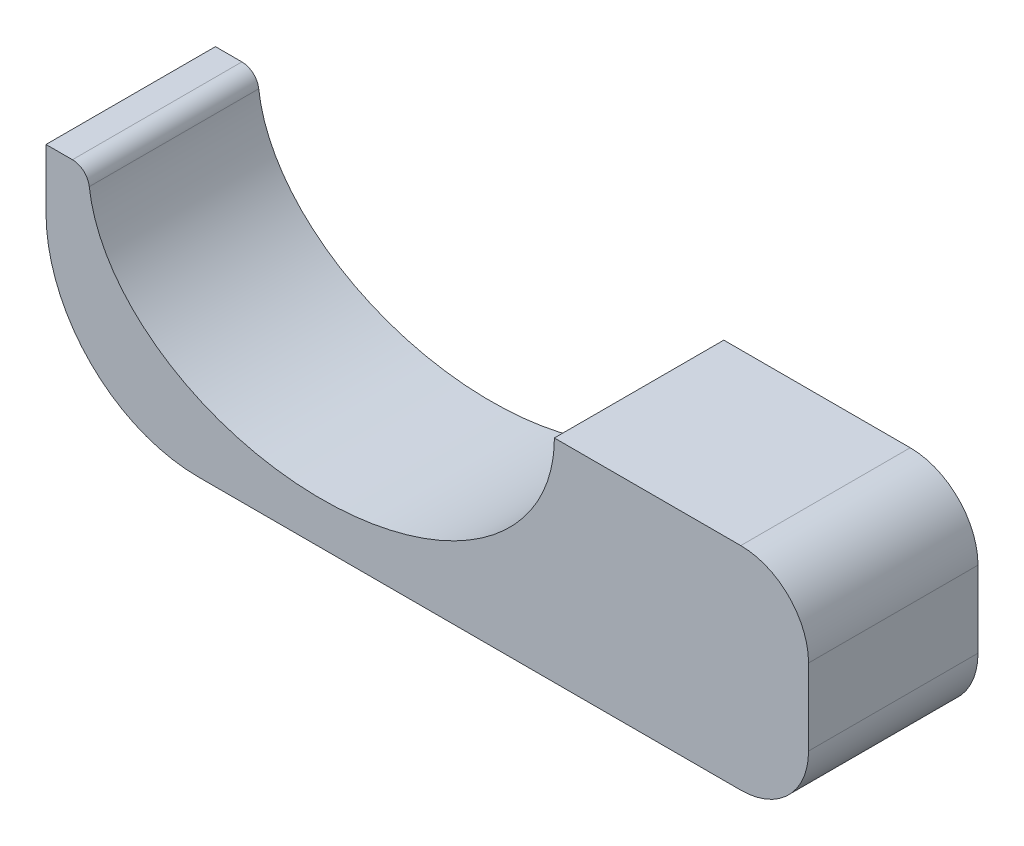
ISO-10303-21;
HEADER;
FILE_DESCRIPTION(('STEP AP214'),'2;1');
FILE_NAME('part.step','',(''),(''),'','','');
FILE_SCHEMA(('AUTOMOTIVE_DESIGN { 1 0 10303 214 1 1 1 1 }'));
ENDSEC;
DATA;
#1=APPLICATION_CONTEXT('core data for automotive mechanical design processes');
#2=APPLICATION_PROTOCOL_DEFINITION('international standard','automotive_design',2000,#1);
#3=PRODUCT_CONTEXT('',#1,'mechanical');
#4=PRODUCT('Part','Part','',(#3));
#5=PRODUCT_RELATED_PRODUCT_CATEGORY('part','',(#4));
#6=PRODUCT_DEFINITION_FORMATION('','',#4);
#7=PRODUCT_DEFINITION_CONTEXT('part definition',#1,'design');
#8=PRODUCT_DEFINITION('design','',#6,#7);
#9=PRODUCT_DEFINITION_SHAPE('','',#8);
#10=(LENGTH_UNIT() NAMED_UNIT(*) SI_UNIT(.MILLI.,.METRE.));
#11=(NAMED_UNIT(*) PLANE_ANGLE_UNIT() SI_UNIT($,.RADIAN.));
#12=(NAMED_UNIT(*) SI_UNIT($,.STERADIAN.) SOLID_ANGLE_UNIT());
#13=UNCERTAINTY_MEASURE_WITH_UNIT(LENGTH_MEASURE(1.E-05),#10,'distance_accuracy_value','');
#14=(GEOMETRIC_REPRESENTATION_CONTEXT(3) GLOBAL_UNCERTAINTY_ASSIGNED_CONTEXT((#13)) GLOBAL_UNIT_ASSIGNED_CONTEXT((#10,
#11,#12)) REPRESENTATION_CONTEXT('',''));
#15=CARTESIAN_POINT('',(0.,0.,0.));
#16=DIRECTION('',(0.,0.,1.));
#17=DIRECTION('',(1.,0.,0.));
#18=AXIS2_PLACEMENT_3D('',#15,#16,#17);
#19=CARTESIAN_POINT('',(0.,31.75,0.));
#20=DIRECTION('',(0.,1.,0.));
#21=DIRECTION('',(0.,0.,1.));
#22=AXIS2_PLACEMENT_3D('',#19,#20,#21);
#23=PLANE('',#22);
#24=DIRECTION('',(1.,0.,0.));
#25=VECTOR('',#24,1.);
#26=CARTESIAN_POINT('',(-57.15,31.75,12.7));
#27=LINE('',#26,#25);
#28=CARTESIAN_POINT('',(-57.15,31.75,12.7));
#29=VERTEX_POINT('',#28);
#30=CARTESIAN_POINT('',(-53.1861536525858,31.75,12.7));
#31=VERTEX_POINT('',#30);
#32=EDGE_CURVE('E188',#29,#31,#27,.T.);
#33=ORIENTED_EDGE('',*,*,#32,.T.);
#34=DIRECTION('',(0.,0.,-1.));
#35=VECTOR('',#34,1.);
#36=CARTESIAN_POINT('',(-53.1861536525858,31.75,-12.7));
#37=LINE('',#36,#35);
#38=CARTESIAN_POINT('',(-53.1861536525858,31.75,-12.7));
#39=VERTEX_POINT('',#38);
#40=EDGE_CURVE('E153',#31,#39,#37,.T.);
#41=ORIENTED_EDGE('',*,*,#40,.T.);
#42=DIRECTION('',(-1.,0.,0.));
#43=VECTOR('',#42,1.);
#44=CARTESIAN_POINT('',(-57.15,31.75,-12.7));
#45=LINE('',#44,#43);
#46=CARTESIAN_POINT('',(-57.15,31.75,-12.7));
#47=VERTEX_POINT('',#46);
#48=EDGE_CURVE('E126',#39,#47,#45,.T.);
#49=ORIENTED_EDGE('',*,*,#48,.T.);
#50=DIRECTION('',(0.,0.,1.));
#51=VECTOR('',#50,1.);
#52=CARTESIAN_POINT('',(-57.15,31.75,-12.7));
#53=LINE('',#52,#51);
#54=EDGE_CURVE('E125',#47,#29,#53,.T.);
#55=ORIENTED_EDGE('',*,*,#54,.T.);
#56=EDGE_LOOP('',(#33,#41,#49,#55));
#57=FACE_BOUND('',#56,.T.);
#58=ADVANCED_FACE('F37',(#57),#23,.T.);
#59=CARTESIAN_POINT('',(57.15,31.75,-12.7));
#60=DIRECTION('',(-1.,0.,0.));
#61=DIRECTION('',(0.,0.,1.));
#62=AXIS2_PLACEMENT_3D('',#59,#60,#61);
#63=PLANE('',#62);
#64=DIRECTION('',(0.,-1.,0.));
#65=VECTOR('',#64,1.);
#66=CARTESIAN_POINT('',(57.15,31.75,12.7));
#67=LINE('',#66,#65);
#68=CARTESIAN_POINT('',(57.15,21.59,12.7));
#69=VERTEX_POINT('',#68);
#70=CARTESIAN_POINT('',(57.15,10.16,12.7));
#71=VERTEX_POINT('',#70);
#72=EDGE_CURVE('E179',#69,#71,#67,.T.);
#73=ORIENTED_EDGE('',*,*,#72,.T.);
#74=DIRECTION('',(0.,0.,-1.));
#75=VECTOR('',#74,1.);
#76=CARTESIAN_POINT('',(57.15,10.16,-12.7));
#77=LINE('',#76,#75);
#78=CARTESIAN_POINT('',(57.15,10.16,-12.7));
#79=VERTEX_POINT('',#78);
#80=EDGE_CURVE('E168',#71,#79,#77,.T.);
#81=ORIENTED_EDGE('',*,*,#80,.T.);
#82=DIRECTION('',(0.,-1.,0.));
#83=VECTOR('',#82,1.);
#84=CARTESIAN_POINT('',(57.15,31.75,-12.7));
#85=LINE('',#84,#83);
#86=CARTESIAN_POINT('',(57.15,21.59,-12.7));
#87=VERTEX_POINT('',#86);
#88=EDGE_CURVE('E144',#87,#79,#85,.T.);
#89=ORIENTED_EDGE('',*,*,#88,.F.);
#90=DIRECTION('',(0.,0.,-1.));
#91=VECTOR('',#90,1.);
#92=CARTESIAN_POINT('',(57.15,21.59,12.7));
#93=LINE('',#92,#91);
#94=EDGE_CURVE('E166',#87,#69,#93,.F.);
#95=ORIENTED_EDGE('',*,*,#94,.T.);
#96=EDGE_LOOP('',(#73,#81,#89,#95));
#97=FACE_BOUND('',#96,.T.);
#98=ADVANCED_FACE('F184',(#97),#63,.F.);
#99=CARTESIAN_POINT('',(-57.15,31.75,-12.7));
#100=DIRECTION('',(0.,0.,1.));
#101=DIRECTION('',(1.,0.,0.));
#102=AXIS2_PLACEMENT_3D('',#99,#100,#101);
#103=PLANE('',#102);
#104=ORIENTED_EDGE('',*,*,#88,.T.);
#105=CARTESIAN_POINT('',(46.99,10.16,-12.7));
#106=DIRECTION('',(0.,0.,1.));
#107=DIRECTION('',(1.,0.,0.));
#108=AXIS2_PLACEMENT_3D('',#105,#106,#107);
#109=CIRCLE('',#108,10.16);
#110=CARTESIAN_POINT('',(46.99,0.,-12.7));
#111=VERTEX_POINT('',#110);
#112=EDGE_CURVE('E173',#79,#111,#109,.F.);
#113=ORIENTED_EDGE('',*,*,#112,.T.);
#114=DIRECTION('',(-1.,0.,0.));
#115=VECTOR('',#114,1.);
#116=CARTESIAN_POINT('',(-57.15,0.,-12.7));
#117=LINE('',#116,#115);
#118=CARTESIAN_POINT('',(-34.29,0.,-12.7));
#119=VERTEX_POINT('',#118);
#120=EDGE_CURVE('E138',#111,#119,#117,.T.);
#121=ORIENTED_EDGE('',*,*,#120,.T.);
#122=CARTESIAN_POINT('',(-34.29,22.86,-12.7));
#123=DIRECTION('',(0.,0.,1.));
#124=DIRECTION('',(1.,0.,0.));
#125=AXIS2_PLACEMENT_3D('',#122,#123,#124);
#126=CIRCLE('',#125,22.86);
#127=CARTESIAN_POINT('',(-57.15,22.86,-12.7));
#128=VERTEX_POINT('',#127);
#129=EDGE_CURVE('E164',#119,#128,#126,.F.);
#130=ORIENTED_EDGE('',*,*,#129,.T.);
#131=DIRECTION('',(0.,-1.,0.));
#132=VECTOR('',#131,1.);
#133=CARTESIAN_POINT('',(-57.15,31.75,-12.7));
#134=LINE('',#133,#132);
#135=EDGE_CURVE('E148',#47,#128,#134,.T.);
#136=ORIENTED_EDGE('',*,*,#135,.F.);
#137=ORIENTED_EDGE('',*,*,#48,.F.);
#138=CARTESIAN_POINT('',(-53.1861536525858,29.21,-12.7));
#139=DIRECTION('',(0.,0.,1.));
#140=DIRECTION('',(1.,0.,0.));
#141=AXIS2_PLACEMENT_3D('',#138,#139,#140);
#142=CIRCLE('',#141,2.54);
#143=CARTESIAN_POINT('',(-50.6646663698128,29.5161076327277,-12.7));
#144=VERTEX_POINT('',#143);
#145=EDGE_CURVE('E134',#39,#144,#142,.F.);
#146=ORIENTED_EDGE('',*,*,#145,.T.);
#147=CARTESIAN_POINT('',(-15.875,31.75,-12.7));
#148=DIRECTION('',(0.,0.,1.));
#149=DIRECTION('',(-1.,0.,0.));
#150=AXIS2_PLACEMENT_3D('',#147,#148,#149);
#151=ELLIPSE('',#150,34.925,25.4);
#152=CARTESIAN_POINT('',(19.05,31.75,-12.7));
#153=VERTEX_POINT('',#152);
#154=EDGE_CURVE('E129',#144,#153,#151,.T.);
#155=ORIENTED_EDGE('',*,*,#154,.T.);
#156=CARTESIAN_POINT('',(46.99,31.75,-12.7));
#157=VERTEX_POINT('',#156);
#158=EDGE_CURVE('E118',#157,#153,#45,.T.);
#159=ORIENTED_EDGE('',*,*,#158,.F.);
#160=CARTESIAN_POINT('',(46.99,21.59,-12.7));
#161=DIRECTION('',(0.,0.,1.));
#162=DIRECTION('',(1.,0.,0.));
#163=AXIS2_PLACEMENT_3D('',#160,#161,#162);
#164=CIRCLE('',#163,10.16);
#165=EDGE_CURVE('E171',#157,#87,#164,.F.);
#166=ORIENTED_EDGE('',*,*,#165,.T.);
#167=EDGE_LOOP('',(#104,#113,#121,#130,#136,#137,#146,#155,#159,#166));
#168=FACE_BOUND('',#167,.T.);
#169=ADVANCED_FACE('F131',(#168),#103,.F.);
#170=CARTESIAN_POINT('',(-57.15,31.75,-12.7));
#171=DIRECTION('',(1.,0.,0.));
#172=DIRECTION('',(0.,0.,-1.));
#173=AXIS2_PLACEMENT_3D('',#170,#171,#172);
#174=PLANE('',#173);
#175=ORIENTED_EDGE('',*,*,#135,.T.);
#176=DIRECTION('',(0.,0.,1.));
#177=VECTOR('',#176,1.);
#178=CARTESIAN_POINT('',(-57.15,22.86,-12.7));
#179=LINE('',#178,#177);
#180=CARTESIAN_POINT('',(-57.15,22.86,12.7));
#181=VERTEX_POINT('',#180);
#182=EDGE_CURVE('E156',#128,#181,#179,.T.);
#183=ORIENTED_EDGE('',*,*,#182,.T.);
#184=DIRECTION('',(0.,-1.,0.));
#185=VECTOR('',#184,1.);
#186=CARTESIAN_POINT('',(-57.15,31.75,12.7));
#187=LINE('',#186,#185);
#188=EDGE_CURVE('E187',#29,#181,#187,.T.);
#189=ORIENTED_EDGE('',*,*,#188,.F.);
#190=ORIENTED_EDGE('',*,*,#54,.F.);
#191=EDGE_LOOP('',(#175,#183,#189,#190));
#192=FACE_BOUND('',#191,.T.);
#193=ADVANCED_FACE('F205',(#192),#174,.F.);
#194=CARTESIAN_POINT('',(-57.15,31.75,12.7));
#195=DIRECTION('',(0.,0.,-1.));
#196=DIRECTION('',(-1.,0.,0.));
#197=AXIS2_PLACEMENT_3D('',#194,#195,#196);
#198=PLANE('',#197);
#199=DIRECTION('',(1.,0.,0.));
#200=VECTOR('',#199,1.);
#201=CARTESIAN_POINT('',(-57.15,0.,12.7));
#202=LINE('',#201,#200);
#203=CARTESIAN_POINT('',(-34.29,0.,12.7));
#204=VERTEX_POINT('',#203);
#205=CARTESIAN_POINT('',(46.99,0.,12.7));
#206=VERTEX_POINT('',#205);
#207=EDGE_CURVE('E180',#204,#206,#202,.T.);
#208=ORIENTED_EDGE('',*,*,#207,.T.);
#209=CARTESIAN_POINT('',(46.99,10.16,12.7));
#210=DIRECTION('',(0.,0.,-1.));
#211=DIRECTION('',(-1.,0.,0.));
#212=AXIS2_PLACEMENT_3D('',#209,#210,#211);
#213=CIRCLE('',#212,10.16);
#214=EDGE_CURVE('E45',#206,#71,#213,.F.);
#215=ORIENTED_EDGE('',*,*,#214,.T.);
#216=ORIENTED_EDGE('',*,*,#72,.F.);
#217=CARTESIAN_POINT('',(46.99,21.59,12.7));
#218=DIRECTION('',(0.,0.,-1.));
#219=DIRECTION('',(-1.,0.,0.));
#220=AXIS2_PLACEMENT_3D('',#217,#218,#219);
#221=CIRCLE('',#220,10.16);
#222=CARTESIAN_POINT('',(46.99,31.75,12.7));
#223=VERTEX_POINT('',#222);
#224=EDGE_CURVE('E52',#69,#223,#221,.F.);
#225=ORIENTED_EDGE('',*,*,#224,.T.);
#226=CARTESIAN_POINT('',(19.05,31.75,12.7));
#227=VERTEX_POINT('',#226);
#228=EDGE_CURVE('E213',#227,#223,#27,.T.);
#229=ORIENTED_EDGE('',*,*,#228,.F.);
#230=CARTESIAN_POINT('',(-15.875,31.75,12.7));
#231=DIRECTION('',(0.,0.,1.));
#232=DIRECTION('',(-1.,0.,0.));
#233=AXIS2_PLACEMENT_3D('',#230,#231,#232);
#234=ELLIPSE('',#233,34.925,25.4);
#235=CARTESIAN_POINT('',(-50.6646663698128,29.5161076327277,12.7));
#236=VERTEX_POINT('',#235);
#237=EDGE_CURVE('E139',#236,#227,#234,.T.);
#238=ORIENTED_EDGE('',*,*,#237,.F.);
#239=CARTESIAN_POINT('',(-53.1861536525858,29.21,12.7));
#240=DIRECTION('',(0.,0.,-1.));
#241=DIRECTION('',(-1.,0.,0.));
#242=AXIS2_PLACEMENT_3D('',#239,#240,#241);
#243=CIRCLE('',#242,2.54);
#244=EDGE_CURVE('E146',#236,#31,#243,.F.);
#245=ORIENTED_EDGE('',*,*,#244,.T.);
#246=ORIENTED_EDGE('',*,*,#32,.F.);
#247=ORIENTED_EDGE('',*,*,#188,.T.);
#248=CARTESIAN_POINT('',(-34.29,22.86,12.7));
#249=DIRECTION('',(0.,0.,-1.));
#250=DIRECTION('',(-1.,0.,0.));
#251=AXIS2_PLACEMENT_3D('',#248,#249,#250);
#252=CIRCLE('',#251,22.86);
#253=EDGE_CURVE('E159',#181,#204,#252,.F.);
#254=ORIENTED_EDGE('',*,*,#253,.T.);
#255=EDGE_LOOP('',(#208,#215,#216,#225,#229,#238,#245,#246,#247,#254));
#256=FACE_BOUND('',#255,.T.);
#257=ADVANCED_FACE('F178',(#256),#198,.F.);
#258=ORIENTED_EDGE('',*,*,#228,.T.);
#259=DIRECTION('',(0.,0.,-1.));
#260=VECTOR('',#259,1.);
#261=CARTESIAN_POINT('',(46.99,31.75,-12.7));
#262=LINE('',#261,#260);
#263=EDGE_CURVE('E11',#223,#157,#262,.T.);
#264=ORIENTED_EDGE('',*,*,#263,.T.);
#265=ORIENTED_EDGE('',*,*,#158,.T.);
#266=DIRECTION('',(0.,0.,1.));
#267=VECTOR('',#266,1.);
#268=CARTESIAN_POINT('',(19.05,31.75,-12.7));
#269=LINE('',#268,#267);
#270=EDGE_CURVE('E122',#227,#153,#269,.F.);
#271=ORIENTED_EDGE('',*,*,#270,.F.);
#272=EDGE_LOOP('',(#258,#264,#265,#271));
#273=FACE_BOUND('',#272,.T.);
#274=ADVANCED_FACE('F120',(#273),#23,.T.);
#275=CARTESIAN_POINT('',(0.,0.,0.));
#276=DIRECTION('',(0.,1.,0.));
#277=DIRECTION('',(0.,0.,1.));
#278=AXIS2_PLACEMENT_3D('',#275,#276,#277);
#279=PLANE('',#278);
#280=ORIENTED_EDGE('',*,*,#120,.F.);
#281=DIRECTION('',(0.,0.,-1.));
#282=VECTOR('',#281,1.);
#283=CARTESIAN_POINT('',(46.99,0.,0.));
#284=LINE('',#283,#282);
#285=EDGE_CURVE('E60',#111,#206,#284,.F.);
#286=ORIENTED_EDGE('',*,*,#285,.T.);
#287=ORIENTED_EDGE('',*,*,#207,.F.);
#288=DIRECTION('',(0.,0.,1.));
#289=VECTOR('',#288,1.);
#290=CARTESIAN_POINT('',(-34.29,0.,0.));
#291=LINE('',#290,#289);
#292=EDGE_CURVE('E161',#204,#119,#291,.F.);
#293=ORIENTED_EDGE('',*,*,#292,.T.);
#294=EDGE_LOOP('',(#280,#286,#287,#293));
#295=FACE_BOUND('',#294,.T.);
#296=ADVANCED_FACE('F191',(#295),#279,.F.);
#297=DIRECTION('',(0.,0.,1.));
#298=VECTOR('',#297,1.);
#299=SURFACE_OF_LINEAR_EXTRUSION('',#151,#298);
#300=ORIENTED_EDGE('',*,*,#154,.F.);
#301=DIRECTION('',(0.,0.,1.));
#302=VECTOR('',#301,1.);
#303=CARTESIAN_POINT('',(-50.6646663698128,29.5161076327277,-12.7));
#304=LINE('',#303,#302);
#305=EDGE_CURVE('E143',#144,#236,#304,.T.);
#306=ORIENTED_EDGE('',*,*,#305,.T.);
#307=ORIENTED_EDGE('',*,*,#237,.T.);
#308=ORIENTED_EDGE('',*,*,#270,.T.);
#309=EDGE_LOOP('',(#300,#306,#307,#308));
#310=FACE_BOUND('',#309,.T.);
#311=ADVANCED_FACE('F141',(#310),#299,.F.);
#312=CARTESIAN_POINT('',(-53.1861536525858,29.21,0.));
#313=DIRECTION('',(0.,0.,1.));
#314=DIRECTION('',(1.,0.,0.));
#315=AXIS2_PLACEMENT_3D('',#312,#313,#314);
#316=CYLINDRICAL_SURFACE('',#315,2.54);
#317=ORIENTED_EDGE('',*,*,#145,.F.);
#318=ORIENTED_EDGE('',*,*,#40,.F.);
#319=ORIENTED_EDGE('',*,*,#244,.F.);
#320=ORIENTED_EDGE('',*,*,#305,.F.);
#321=EDGE_LOOP('',(#317,#318,#319,#320));
#322=FACE_BOUND('',#321,.T.);
#323=ADVANCED_FACE('F219',(#322),#316,.T.);
#324=CARTESIAN_POINT('',(-34.29,22.86,-12.7));
#325=DIRECTION('',(0.,0.,1.));
#326=DIRECTION('',(1.,0.,0.));
#327=AXIS2_PLACEMENT_3D('',#324,#325,#326);
#328=CYLINDRICAL_SURFACE('',#327,22.86);
#329=ORIENTED_EDGE('',*,*,#129,.F.);
#330=ORIENTED_EDGE('',*,*,#292,.F.);
#331=ORIENTED_EDGE('',*,*,#253,.F.);
#332=ORIENTED_EDGE('',*,*,#182,.F.);
#333=EDGE_LOOP('',(#329,#330,#331,#332));
#334=FACE_BOUND('',#333,.T.);
#335=ADVANCED_FACE('F208',(#334),#328,.T.);
#336=CARTESIAN_POINT('',(46.99,10.16,-12.7));
#337=DIRECTION('',(0.,0.,-1.));
#338=DIRECTION('',(-1.,0.,0.));
#339=AXIS2_PLACEMENT_3D('',#336,#337,#338);
#340=CYLINDRICAL_SURFACE('',#339,10.16);
#341=ORIENTED_EDGE('',*,*,#214,.F.);
#342=ORIENTED_EDGE('',*,*,#285,.F.);
#343=ORIENTED_EDGE('',*,*,#112,.F.);
#344=ORIENTED_EDGE('',*,*,#80,.F.);
#345=EDGE_LOOP('',(#341,#342,#343,#344));
#346=FACE_BOUND('',#345,.T.);
#347=ADVANCED_FACE('F190',(#346),#340,.T.);
#348=CARTESIAN_POINT('',(46.99,21.59,0.));
#349=DIRECTION('',(0.,0.,1.));
#350=DIRECTION('',(1.,0.,0.));
#351=AXIS2_PLACEMENT_3D('',#348,#349,#350);
#352=CYLINDRICAL_SURFACE('',#351,10.16);
#353=ORIENTED_EDGE('',*,*,#224,.F.);
#354=ORIENTED_EDGE('',*,*,#94,.F.);
#355=ORIENTED_EDGE('',*,*,#165,.F.);
#356=ORIENTED_EDGE('',*,*,#263,.F.);
#357=EDGE_LOOP('',(#353,#354,#355,#356));
#358=FACE_BOUND('',#357,.T.);
#359=ADVANCED_FACE('F39',(#358),#352,.T.);
#360=CLOSED_SHELL('',(#58,#98,#169,#193,#257,#274,#296,#311,#323,#335,#347,#359));
#361=MANIFOLD_SOLID_BREP('B2',#360);
#362=ADVANCED_BREP_SHAPE_REPRESENTATION('',(#18,#361),#14);
#363=SHAPE_DEFINITION_REPRESENTATION(#9,#362);
ENDSEC;
END-ISO-10303-21;
